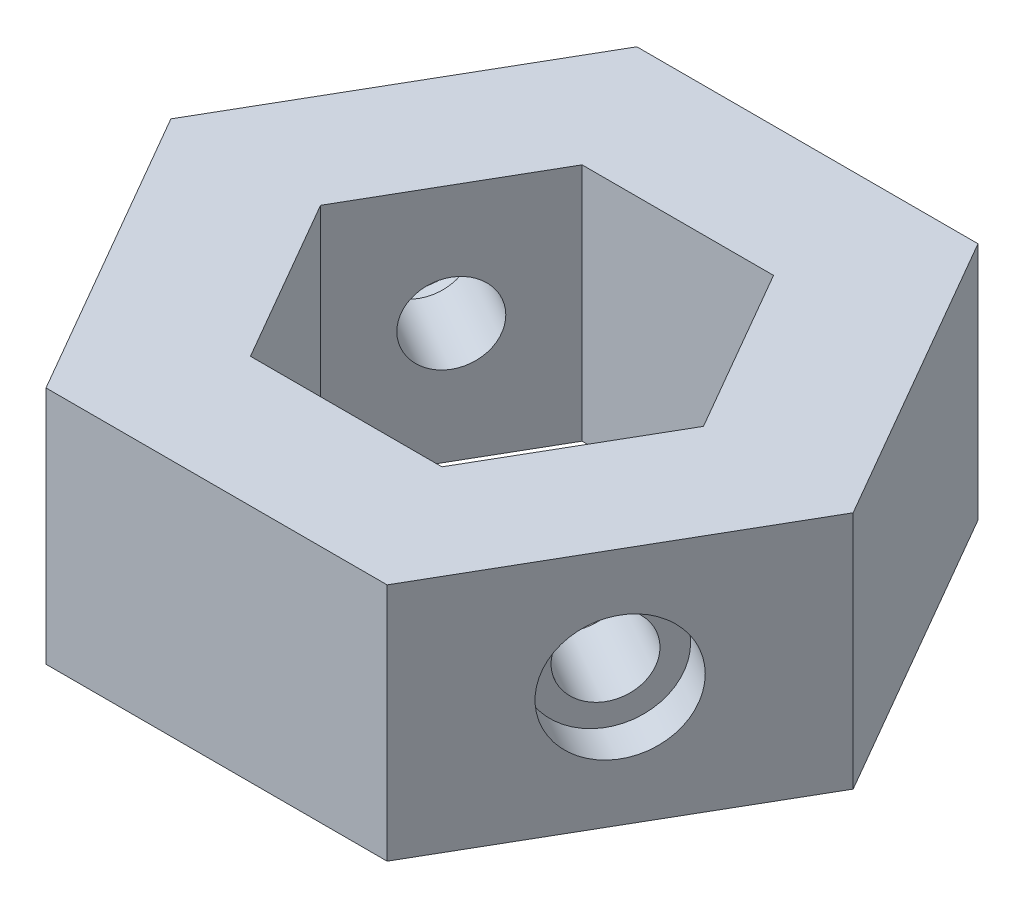
ISO-10303-21;
HEADER;
FILE_DESCRIPTION(('STEP AP214'),'2;1');
FILE_NAME('part.step','',(''),(''),'','','');
FILE_SCHEMA(('AUTOMOTIVE_DESIGN { 1 0 10303 214 1 1 1 1 }'));
ENDSEC;
DATA;
#1=APPLICATION_CONTEXT('core data for automotive mechanical design processes');
#2=APPLICATION_PROTOCOL_DEFINITION('international standard','automotive_design',2000,#1);
#3=PRODUCT_CONTEXT('',#1,'mechanical');
#4=PRODUCT('Part','Part','',(#3));
#5=PRODUCT_RELATED_PRODUCT_CATEGORY('part','',(#4));
#6=PRODUCT_DEFINITION_FORMATION('','',#4);
#7=PRODUCT_DEFINITION_CONTEXT('part definition',#1,'design');
#8=PRODUCT_DEFINITION('design','',#6,#7);
#9=PRODUCT_DEFINITION_SHAPE('','',#8);
#10=(LENGTH_UNIT() NAMED_UNIT(*) SI_UNIT(.MILLI.,.METRE.));
#11=(NAMED_UNIT(*) PLANE_ANGLE_UNIT() SI_UNIT($,.RADIAN.));
#12=(NAMED_UNIT(*) SI_UNIT($,.STERADIAN.) SOLID_ANGLE_UNIT());
#13=UNCERTAINTY_MEASURE_WITH_UNIT(LENGTH_MEASURE(1.E-05),#10,'distance_accuracy_value','');
#14=(GEOMETRIC_REPRESENTATION_CONTEXT(3) GLOBAL_UNCERTAINTY_ASSIGNED_CONTEXT((#13)) GLOBAL_UNIT_ASSIGNED_CONTEXT((#10,
#11,#12)) REPRESENTATION_CONTEXT('',''));
#15=CARTESIAN_POINT('',(0.,0.,0.));
#16=DIRECTION('',(0.,0.,1.));
#17=DIRECTION('',(1.,0.,0.));
#18=AXIS2_PLACEMENT_3D('',#15,#16,#17);
#19=CARTESIAN_POINT('',(0.,9.525,0.));
#20=DIRECTION('',(0.,1.,0.));
#21=DIRECTION('',(0.,0.,1.));
#22=AXIS2_PLACEMENT_3D('',#19,#20,#21);
#23=PLANE('',#22);
#24=DIRECTION('',(0.5,0.,-0.866025403784439));
#25=VECTOR('',#24,1.);
#26=CARTESIAN_POINT('',(6.78876654510022,9.525,11.7584885768374));
#27=LINE('',#26,#25);
#28=CARTESIAN_POINT('',(6.78876654510022,9.525,11.7584885768374));
#29=VERTEX_POINT('',#28);
#30=CARTESIAN_POINT('',(13.5775330902004,9.525,0.));
#31=VERTEX_POINT('',#30);
#32=EDGE_CURVE('E176',#29,#31,#27,.T.);
#33=ORIENTED_EDGE('',*,*,#32,.T.);
#34=DIRECTION('',(-0.5,0.,-0.866025403784439));
#35=VECTOR('',#34,1.);
#36=CARTESIAN_POINT('',(13.5775330902004,9.525,0.));
#37=LINE('',#36,#35);
#38=CARTESIAN_POINT('',(6.78876654510022,9.525,-11.7584885768374));
#39=VERTEX_POINT('',#38);
#40=EDGE_CURVE('E179',#31,#39,#37,.T.);
#41=ORIENTED_EDGE('',*,*,#40,.T.);
#42=DIRECTION('',(-1.,0.,0.));
#43=VECTOR('',#42,1.);
#44=CARTESIAN_POINT('',(6.78876654510022,9.525,-11.7584885768374));
#45=LINE('',#44,#43);
#46=CARTESIAN_POINT('',(-6.78876654510022,9.525,-11.7584885768374));
#47=VERTEX_POINT('',#46);
#48=EDGE_CURVE('E182',#39,#47,#45,.T.);
#49=ORIENTED_EDGE('',*,*,#48,.T.);
#50=DIRECTION('',(-0.5,0.,0.866025403784439));
#51=VECTOR('',#50,1.);
#52=CARTESIAN_POINT('',(-6.78876654510022,9.525,-11.7584885768374));
#53=LINE('',#52,#51);
#54=CARTESIAN_POINT('',(-13.5775330902004,9.525,0.));
#55=VERTEX_POINT('',#54);
#56=EDGE_CURVE('E184',#47,#55,#53,.T.);
#57=ORIENTED_EDGE('',*,*,#56,.T.);
#58=DIRECTION('',(0.5,0.,0.866025403784438));
#59=VECTOR('',#58,1.);
#60=CARTESIAN_POINT('',(-13.5775330902004,9.525,0.));
#61=LINE('',#60,#59);
#62=CARTESIAN_POINT('',(-6.78876654510022,9.525,11.7584885768374));
#63=VERTEX_POINT('',#62);
#64=EDGE_CURVE('E186',#55,#63,#61,.T.);
#65=ORIENTED_EDGE('',*,*,#64,.T.);
#66=DIRECTION('',(1.,0.,0.));
#67=VECTOR('',#66,1.);
#68=CARTESIAN_POINT('',(-6.78876654510022,9.525,11.7584885768374));
#69=LINE('',#68,#67);
#70=EDGE_CURVE('E188',#63,#29,#69,.T.);
#71=ORIENTED_EDGE('',*,*,#70,.T.);
#72=EDGE_LOOP('',(#33,#41,#49,#57,#65,#71));
#73=FACE_BOUND('',#72,.T.);
#74=DIRECTION('',(-0.500000000000001,0.,-0.866025403784438));
#75=VECTOR('',#74,1.);
#76=CARTESIAN_POINT('',(7.61999999999998,9.525,0.));
#77=LINE('',#76,#75);
#78=CARTESIAN_POINT('',(7.61999999999998,9.525,0.));
#79=VERTEX_POINT('',#78);
#80=CARTESIAN_POINT('',(3.80999999999998,9.525,-6.59911357683742));
#81=VERTEX_POINT('',#80);
#82=EDGE_CURVE('E131',#79,#81,#77,.T.);
#83=ORIENTED_EDGE('',*,*,#82,.F.);
#84=DIRECTION('',(0.499999999999995,0.,-0.866025403784442));
#85=VECTOR('',#84,1.);
#86=CARTESIAN_POINT('',(3.81000000000007,9.525,6.59911357683736));
#87=LINE('',#86,#85);
#88=CARTESIAN_POINT('',(3.81000000000007,9.525,6.59911357683736));
#89=VERTEX_POINT('',#88);
#90=EDGE_CURVE('E123',#89,#79,#87,.T.);
#91=ORIENTED_EDGE('',*,*,#90,.F.);
#92=DIRECTION('',(1.,0.,0.));
#93=VECTOR('',#92,1.);
#94=CARTESIAN_POINT('',(-3.80999999999993,9.525,6.59911357683744));
#95=LINE('',#94,#93);
#96=CARTESIAN_POINT('',(-3.80999999999993,9.525,6.59911357683744));
#97=VERTEX_POINT('',#96);
#98=EDGE_CURVE('E153',#97,#89,#95,.T.);
#99=ORIENTED_EDGE('',*,*,#98,.F.);
#100=DIRECTION('',(0.500000000000007,0.,0.866025403784435));
#101=VECTOR('',#100,1.);
#102=CARTESIAN_POINT('',(-7.61999999999998,9.525,0.));
#103=LINE('',#102,#101);
#104=CARTESIAN_POINT('',(-7.61999999999998,9.525,0.));
#105=VERTEX_POINT('',#104);
#106=EDGE_CURVE('E151',#105,#97,#103,.T.);
#107=ORIENTED_EDGE('',*,*,#106,.F.);
#108=DIRECTION('',(-0.499999999999995,0.,0.866025403784441));
#109=VECTOR('',#108,1.);
#110=CARTESIAN_POINT('',(-3.81000000000002,9.525,-6.59911357683739));
#111=LINE('',#110,#109);
#112=CARTESIAN_POINT('',(-3.81000000000002,9.525,-6.59911357683739));
#113=VERTEX_POINT('',#112);
#114=EDGE_CURVE('E146',#113,#105,#111,.T.);
#115=ORIENTED_EDGE('',*,*,#114,.F.);
#116=DIRECTION('',(-1.,0.,0.));
#117=VECTOR('',#116,1.);
#118=CARTESIAN_POINT('',(3.80999999999998,9.525,-6.59911357683742));
#119=LINE('',#118,#117);
#120=EDGE_CURVE('E144',#81,#113,#119,.T.);
#121=ORIENTED_EDGE('',*,*,#120,.F.);
#122=EDGE_LOOP('',(#83,#91,#99,#107,#115,#121));
#123=FACE_BOUND('',#122,.T.);
#124=ADVANCED_FACE('F32',(#73,#123),#23,.T.);
#125=CARTESIAN_POINT('',(0.,0.,0.));
#126=DIRECTION('',(0.,1.,0.));
#127=DIRECTION('',(0.,0.,1.));
#128=AXIS2_PLACEMENT_3D('',#125,#126,#127);
#129=PLANE('',#128);
#130=DIRECTION('',(0.5,0.,-0.866025403784439));
#131=VECTOR('',#130,1.);
#132=CARTESIAN_POINT('',(6.78876654510022,0.,11.7584885768374));
#133=LINE('',#132,#131);
#134=CARTESIAN_POINT('',(6.78876654510022,0.,11.7584885768374));
#135=VERTEX_POINT('',#134);
#136=CARTESIAN_POINT('',(13.5775330902004,0.,0.));
#137=VERTEX_POINT('',#136);
#138=EDGE_CURVE('E139',#135,#137,#133,.T.);
#139=ORIENTED_EDGE('',*,*,#138,.F.);
#140=DIRECTION('',(1.,0.,0.));
#141=VECTOR('',#140,1.);
#142=CARTESIAN_POINT('',(-6.78876654510022,0.,11.7584885768374));
#143=LINE('',#142,#141);
#144=CARTESIAN_POINT('',(-6.78876654510022,0.,11.7584885768374));
#145=VERTEX_POINT('',#144);
#146=EDGE_CURVE('E180',#145,#135,#143,.T.);
#147=ORIENTED_EDGE('',*,*,#146,.F.);
#148=DIRECTION('',(0.5,0.,0.866025403784438));
#149=VECTOR('',#148,1.);
#150=CARTESIAN_POINT('',(-13.5775330902004,0.,0.));
#151=LINE('',#150,#149);
#152=CARTESIAN_POINT('',(-13.5775330902004,0.,0.));
#153=VERTEX_POINT('',#152);
#154=EDGE_CURVE('E199',#153,#145,#151,.T.);
#155=ORIENTED_EDGE('',*,*,#154,.F.);
#156=DIRECTION('',(-0.5,0.,0.866025403784439));
#157=VECTOR('',#156,1.);
#158=CARTESIAN_POINT('',(-6.78876654510022,0.,-11.7584885768374));
#159=LINE('',#158,#157);
#160=CARTESIAN_POINT('',(-6.78876654510022,0.,-11.7584885768374));
#161=VERTEX_POINT('',#160);
#162=EDGE_CURVE('E197',#161,#153,#159,.T.);
#163=ORIENTED_EDGE('',*,*,#162,.F.);
#164=DIRECTION('',(-1.,0.,0.));
#165=VECTOR('',#164,1.);
#166=CARTESIAN_POINT('',(6.78876654510022,0.,-11.7584885768374));
#167=LINE('',#166,#165);
#168=CARTESIAN_POINT('',(6.78876654510022,0.,-11.7584885768374));
#169=VERTEX_POINT('',#168);
#170=EDGE_CURVE('E195',#169,#161,#167,.T.);
#171=ORIENTED_EDGE('',*,*,#170,.F.);
#172=DIRECTION('',(-0.5,0.,-0.866025403784439));
#173=VECTOR('',#172,1.);
#174=CARTESIAN_POINT('',(13.5775330902004,0.,0.));
#175=LINE('',#174,#173);
#176=EDGE_CURVE('E193',#137,#169,#175,.T.);
#177=ORIENTED_EDGE('',*,*,#176,.F.);
#178=EDGE_LOOP('',(#139,#147,#155,#163,#171,#177));
#179=FACE_BOUND('',#178,.T.);
#180=DIRECTION('',(0.499999999999995,0.,-0.866025403784442));
#181=VECTOR('',#180,1.);
#182=CARTESIAN_POINT('',(3.81000000000007,0.,6.59911357683736));
#183=LINE('',#182,#181);
#184=CARTESIAN_POINT('',(3.81000000000007,0.,6.59911357683736));
#185=VERTEX_POINT('',#184);
#186=CARTESIAN_POINT('',(7.61999999999998,0.,0.));
#187=VERTEX_POINT('',#186);
#188=EDGE_CURVE('E57',#185,#187,#183,.T.);
#189=ORIENTED_EDGE('',*,*,#188,.T.);
#190=DIRECTION('',(-0.500000000000001,0.,-0.866025403784438));
#191=VECTOR('',#190,1.);
#192=CARTESIAN_POINT('',(7.61999999999998,0.,0.));
#193=LINE('',#192,#191);
#194=CARTESIAN_POINT('',(3.80999999999998,0.,-6.59911357683742));
#195=VERTEX_POINT('',#194);
#196=EDGE_CURVE('E138',#187,#195,#193,.T.);
#197=ORIENTED_EDGE('',*,*,#196,.T.);
#198=DIRECTION('',(-1.,0.,0.));
#199=VECTOR('',#198,1.);
#200=CARTESIAN_POINT('',(3.80999999999998,0.,-6.59911357683742));
#201=LINE('',#200,#199);
#202=CARTESIAN_POINT('',(-3.81000000000002,0.,-6.59911357683739));
#203=VERTEX_POINT('',#202);
#204=EDGE_CURVE('E158',#195,#203,#201,.T.);
#205=ORIENTED_EDGE('',*,*,#204,.T.);
#206=DIRECTION('',(-0.499999999999995,0.,0.866025403784441));
#207=VECTOR('',#206,1.);
#208=CARTESIAN_POINT('',(-3.81000000000002,0.,-6.59911357683739));
#209=LINE('',#208,#207);
#210=CARTESIAN_POINT('',(-7.61999999999998,0.,0.));
#211=VERTEX_POINT('',#210);
#212=EDGE_CURVE('E161',#203,#211,#209,.T.);
#213=ORIENTED_EDGE('',*,*,#212,.T.);
#214=DIRECTION('',(0.500000000000007,0.,0.866025403784435));
#215=VECTOR('',#214,1.);
#216=CARTESIAN_POINT('',(-7.61999999999998,0.,0.));
#217=LINE('',#216,#215);
#218=CARTESIAN_POINT('',(-3.80999999999993,0.,6.59911357683744));
#219=VERTEX_POINT('',#218);
#220=EDGE_CURVE('E164',#211,#219,#217,.T.);
#221=ORIENTED_EDGE('',*,*,#220,.T.);
#222=DIRECTION('',(1.,0.,0.));
#223=VECTOR('',#222,1.);
#224=CARTESIAN_POINT('',(-3.80999999999993,0.,6.59911357683744));
#225=LINE('',#224,#223);
#226=EDGE_CURVE('E132',#219,#185,#225,.T.);
#227=ORIENTED_EDGE('',*,*,#226,.T.);
#228=EDGE_LOOP('',(#189,#197,#205,#213,#221,#227));
#229=FACE_BOUND('',#228,.T.);
#230=ADVANCED_FACE('F246',(#179,#229),#129,.F.);
#231=CARTESIAN_POINT('',(6.78876654510022,9.525,11.7584885768374));
#232=DIRECTION('',(-0.866025403784439,0.,-0.5));
#233=DIRECTION('',(-0.5,0.,0.866025403784439));
#234=AXIS2_PLACEMENT_3D('',#231,#232,#233);
#235=PLANE('',#234);
#236=CARTESIAN_POINT('',(10.1831498176503,4.7625,5.8792442884187));
#237=DIRECTION('',(0.866025403784439,0.,0.5));
#238=DIRECTION('',(0.5,0.,-0.866025403784439));
#239=AXIS2_PLACEMENT_3D('',#236,#237,#238);
#240=CIRCLE('',#239,2.48046875);
#241=CARTESIAN_POINT('',(11.4233841926503,4.7625,3.73109533762527));
#242=VERTEX_POINT('',#241);
#243=EDGE_CURVE('E216',#242,#242,#240,.T.);
#244=ORIENTED_EDGE('',*,*,#243,.F.);
#245=EDGE_LOOP('',(#244));
#246=FACE_BOUND('',#245,.T.);
#247=ORIENTED_EDGE('',*,*,#138,.T.);
#248=DIRECTION('',(0.,-1.,0.));
#249=VECTOR('',#248,1.);
#250=CARTESIAN_POINT('',(13.5775330902004,9.525,0.));
#251=LINE('',#250,#249);
#252=EDGE_CURVE('E11',#31,#137,#251,.T.);
#253=ORIENTED_EDGE('',*,*,#252,.F.);
#254=ORIENTED_EDGE('',*,*,#32,.F.);
#255=DIRECTION('',(0.,-1.,0.));
#256=VECTOR('',#255,1.);
#257=CARTESIAN_POINT('',(6.78876654510022,9.525,11.7584885768374));
#258=LINE('',#257,#256);
#259=EDGE_CURVE('E190',#29,#135,#258,.T.);
#260=ORIENTED_EDGE('',*,*,#259,.T.);
#261=EDGE_LOOP('',(#247,#253,#254,#260));
#262=FACE_BOUND('',#261,.T.);
#263=ADVANCED_FACE('F34',(#246,#262),#235,.F.);
#264=CARTESIAN_POINT('',(13.5775330902004,9.525,0.));
#265=DIRECTION('',(-0.866025403784439,0.,0.5));
#266=DIRECTION('',(0.5,0.,0.866025403784438));
#267=AXIS2_PLACEMENT_3D('',#264,#265,#266);
#268=PLANE('',#267);
#269=ORIENTED_EDGE('',*,*,#176,.T.);
#270=DIRECTION('',(0.,-1.,0.));
#271=VECTOR('',#270,1.);
#272=CARTESIAN_POINT('',(6.78876654510022,9.525,-11.7584885768374));
#273=LINE('',#272,#271);
#274=EDGE_CURVE('E41',#39,#169,#273,.T.);
#275=ORIENTED_EDGE('',*,*,#274,.F.);
#276=ORIENTED_EDGE('',*,*,#40,.F.);
#277=ORIENTED_EDGE('',*,*,#252,.T.);
#278=EDGE_LOOP('',(#269,#275,#276,#277));
#279=FACE_BOUND('',#278,.T.);
#280=ADVANCED_FACE('F245',(#279),#268,.F.);
#281=CARTESIAN_POINT('',(6.78876654510022,9.525,-11.7584885768374));
#282=DIRECTION('',(0.,0.,1.));
#283=DIRECTION('',(1.,0.,0.));
#284=AXIS2_PLACEMENT_3D('',#281,#282,#283);
#285=PLANE('',#284);
#286=ORIENTED_EDGE('',*,*,#170,.T.);
#287=DIRECTION('',(0.,-1.,0.));
#288=VECTOR('',#287,1.);
#289=CARTESIAN_POINT('',(-6.78876654510022,9.525,-11.7584885768374));
#290=LINE('',#289,#288);
#291=EDGE_CURVE('E210',#47,#161,#290,.T.);
#292=ORIENTED_EDGE('',*,*,#291,.F.);
#293=ORIENTED_EDGE('',*,*,#48,.F.);
#294=ORIENTED_EDGE('',*,*,#274,.T.);
#295=EDGE_LOOP('',(#286,#292,#293,#294));
#296=FACE_BOUND('',#295,.T.);
#297=ADVANCED_FACE('F274',(#296),#285,.F.);
#298=CARTESIAN_POINT('',(-6.78876654510022,9.525,-11.7584885768374));
#299=DIRECTION('',(0.866025403784439,0.,0.5));
#300=DIRECTION('',(0.5,0.,-0.866025403784439));
#301=AXIS2_PLACEMENT_3D('',#298,#299,#300);
#302=PLANE('',#301);
#303=CARTESIAN_POINT('',(-10.1831498176503,4.7625,-5.8792442884187));
#304=DIRECTION('',(-0.866025403784439,0.,-0.5));
#305=DIRECTION('',(-0.5,0.,0.866025403784439));
#306=AXIS2_PLACEMENT_3D('',#303,#304,#305);
#307=CIRCLE('',#306,2.45760875);
#308=CARTESIAN_POINT('',(-11.4119541926503,4.7625,-3.75089267835578));
#309=VERTEX_POINT('',#308);
#310=EDGE_CURVE('E227',#309,#309,#307,.T.);
#311=ORIENTED_EDGE('',*,*,#310,.F.);
#312=EDGE_LOOP('',(#311));
#313=FACE_BOUND('',#312,.T.);
#314=ORIENTED_EDGE('',*,*,#162,.T.);
#315=DIRECTION('',(0.,-1.,0.));
#316=VECTOR('',#315,1.);
#317=CARTESIAN_POINT('',(-13.5775330902004,9.525,0.));
#318=LINE('',#317,#316);
#319=EDGE_CURVE('E207',#55,#153,#318,.T.);
#320=ORIENTED_EDGE('',*,*,#319,.F.);
#321=ORIENTED_EDGE('',*,*,#56,.F.);
#322=ORIENTED_EDGE('',*,*,#291,.T.);
#323=EDGE_LOOP('',(#314,#320,#321,#322));
#324=FACE_BOUND('',#323,.T.);
#325=ADVANCED_FACE('F270',(#313,#324),#302,.F.);
#326=CARTESIAN_POINT('',(-13.5775330902004,9.525,0.));
#327=DIRECTION('',(0.866025403784439,0.,-0.5));
#328=DIRECTION('',(-0.5,0.,-0.866025403784438));
#329=AXIS2_PLACEMENT_3D('',#326,#327,#328);
#330=PLANE('',#329);
#331=ORIENTED_EDGE('',*,*,#154,.T.);
#332=DIRECTION('',(0.,-1.,0.));
#333=VECTOR('',#332,1.);
#334=CARTESIAN_POINT('',(-6.78876654510022,9.525,11.7584885768374));
#335=LINE('',#334,#333);
#336=EDGE_CURVE('E204',#63,#145,#335,.T.);
#337=ORIENTED_EDGE('',*,*,#336,.F.);
#338=ORIENTED_EDGE('',*,*,#64,.F.);
#339=ORIENTED_EDGE('',*,*,#319,.T.);
#340=EDGE_LOOP('',(#331,#337,#338,#339));
#341=FACE_BOUND('',#340,.T.);
#342=ADVANCED_FACE('F267',(#341),#330,.F.);
#343=CARTESIAN_POINT('',(-6.78876654510022,9.525,11.7584885768374));
#344=DIRECTION('',(0.,0.,-1.));
#345=DIRECTION('',(-1.,0.,0.));
#346=AXIS2_PLACEMENT_3D('',#343,#344,#345);
#347=PLANE('',#346);
#348=ORIENTED_EDGE('',*,*,#146,.T.);
#349=ORIENTED_EDGE('',*,*,#259,.F.);
#350=ORIENTED_EDGE('',*,*,#70,.F.);
#351=ORIENTED_EDGE('',*,*,#336,.T.);
#352=EDGE_LOOP('',(#348,#349,#350,#351));
#353=FACE_BOUND('',#352,.T.);
#354=ADVANCED_FACE('F265',(#353),#347,.F.);
#355=CARTESIAN_POINT('',(3.81000000000007,9.525,6.59911357683736));
#356=DIRECTION('',(-0.866025403784442,0.,-0.499999999999995));
#357=DIRECTION('',(-0.499999999999995,0.,0.866025403784442));
#358=AXIS2_PLACEMENT_3D('',#355,#356,#357);
#359=PLANE('',#358);
#360=CARTESIAN_POINT('',(5.71500000000001,4.7625,3.29955678841871));
#361=DIRECTION('',(-0.866025403784442,0.,-0.499999999999995));
#362=DIRECTION('',(-0.499999999999995,0.,0.866025403784442));
#363=AXIS2_PLACEMENT_3D('',#360,#361,#362);
#364=CIRCLE('',#363,1.5875);
#365=CARTESIAN_POINT('',(6.50875,4.7625,1.92474145991091));
#366=VERTEX_POINT('',#365);
#367=EDGE_CURVE('E214',#366,#366,#364,.T.);
#368=ORIENTED_EDGE('',*,*,#367,.F.);
#369=EDGE_LOOP('',(#368));
#370=FACE_BOUND('',#369,.T.);
#371=ORIENTED_EDGE('',*,*,#188,.F.);
#372=DIRECTION('',(0.,-1.,0.));
#373=VECTOR('',#372,1.);
#374=CARTESIAN_POINT('',(3.81000000000007,9.525,6.59911357683736));
#375=LINE('',#374,#373);
#376=EDGE_CURVE('E127',#89,#185,#375,.T.);
#377=ORIENTED_EDGE('',*,*,#376,.F.);
#378=ORIENTED_EDGE('',*,*,#90,.T.);
#379=DIRECTION('',(0.,-1.,0.));
#380=VECTOR('',#379,1.);
#381=CARTESIAN_POINT('',(7.61999999999998,9.525,0.));
#382=LINE('',#381,#380);
#383=EDGE_CURVE('E126',#79,#187,#382,.T.);
#384=ORIENTED_EDGE('',*,*,#383,.T.);
#385=EDGE_LOOP('',(#371,#377,#378,#384));
#386=FACE_BOUND('',#385,.T.);
#387=ADVANCED_FACE('F125',(#370,#386),#359,.T.);
#388=CARTESIAN_POINT('',(7.61999999999998,9.525,0.));
#389=DIRECTION('',(-0.866025403784438,0.,0.500000000000001));
#390=DIRECTION('',(0.500000000000001,0.,0.866025403784438));
#391=AXIS2_PLACEMENT_3D('',#388,#389,#390);
#392=PLANE('',#391);
#393=ORIENTED_EDGE('',*,*,#196,.F.);
#394=ORIENTED_EDGE('',*,*,#383,.F.);
#395=ORIENTED_EDGE('',*,*,#82,.T.);
#396=DIRECTION('',(0.,-1.,0.));
#397=VECTOR('',#396,1.);
#398=CARTESIAN_POINT('',(3.80999999999998,9.525,-6.59911357683742));
#399=LINE('',#398,#397);
#400=EDGE_CURVE('E140',#81,#195,#399,.T.);
#401=ORIENTED_EDGE('',*,*,#400,.T.);
#402=EDGE_LOOP('',(#393,#394,#395,#401));
#403=FACE_BOUND('',#402,.T.);
#404=ADVANCED_FACE('F135',(#403),#392,.T.);
#405=CARTESIAN_POINT('',(3.80999999999998,9.525,-6.59911357683742));
#406=DIRECTION('',(0.,0.,1.));
#407=DIRECTION('',(1.,0.,0.));
#408=AXIS2_PLACEMENT_3D('',#405,#406,#407);
#409=PLANE('',#408);
#410=ORIENTED_EDGE('',*,*,#204,.F.);
#411=ORIENTED_EDGE('',*,*,#400,.F.);
#412=ORIENTED_EDGE('',*,*,#120,.T.);
#413=DIRECTION('',(0.,-1.,0.));
#414=VECTOR('',#413,1.);
#415=CARTESIAN_POINT('',(-3.81000000000002,9.525,-6.59911357683739));
#416=LINE('',#415,#414);
#417=EDGE_CURVE('E173',#113,#203,#416,.T.);
#418=ORIENTED_EDGE('',*,*,#417,.T.);
#419=EDGE_LOOP('',(#410,#411,#412,#418));
#420=FACE_BOUND('',#419,.T.);
#421=ADVANCED_FACE('F317',(#420),#409,.T.);
#422=CARTESIAN_POINT('',(-3.81000000000002,9.525,-6.59911357683739));
#423=DIRECTION('',(0.866025403784442,0.,0.499999999999995));
#424=DIRECTION('',(0.499999999999995,0.,-0.866025403784442));
#425=AXIS2_PLACEMENT_3D('',#422,#423,#424);
#426=PLANE('',#425);
#427=CARTESIAN_POINT('',(-5.71499999999999,4.7625,-3.2995567884187));
#428=DIRECTION('',(0.866025403784442,0.,0.499999999999995));
#429=DIRECTION('',(0.499999999999995,0.,-0.866025403784442));
#430=AXIS2_PLACEMENT_3D('',#427,#428,#429);
#431=CIRCLE('',#430,1.5875);
#432=CARTESIAN_POINT('',(-4.92124999999999,4.7625,-4.6743721169265));
#433=VERTEX_POINT('',#432);
#434=EDGE_CURVE('E36',#433,#433,#431,.T.);
#435=ORIENTED_EDGE('',*,*,#434,.F.);
#436=EDGE_LOOP('',(#435));
#437=FACE_BOUND('',#436,.T.);
#438=ORIENTED_EDGE('',*,*,#212,.F.);
#439=ORIENTED_EDGE('',*,*,#417,.F.);
#440=ORIENTED_EDGE('',*,*,#114,.T.);
#441=DIRECTION('',(0.,-1.,0.));
#442=VECTOR('',#441,1.);
#443=CARTESIAN_POINT('',(-7.61999999999998,9.525,0.));
#444=LINE('',#443,#442);
#445=EDGE_CURVE('E171',#105,#211,#444,.T.);
#446=ORIENTED_EDGE('',*,*,#445,.T.);
#447=EDGE_LOOP('',(#438,#439,#440,#446));
#448=FACE_BOUND('',#447,.T.);
#449=ADVANCED_FACE('F323',(#437,#448),#426,.T.);
#450=CARTESIAN_POINT('',(-7.61999999999998,9.525,0.));
#451=DIRECTION('',(0.866025403784435,0.,-0.500000000000007));
#452=DIRECTION('',(-0.500000000000007,0.,-0.866025403784435));
#453=AXIS2_PLACEMENT_3D('',#450,#451,#452);
#454=PLANE('',#453);
#455=ORIENTED_EDGE('',*,*,#220,.F.);
#456=ORIENTED_EDGE('',*,*,#445,.F.);
#457=ORIENTED_EDGE('',*,*,#106,.T.);
#458=DIRECTION('',(0.,-1.,0.));
#459=VECTOR('',#458,1.);
#460=CARTESIAN_POINT('',(-3.80999999999993,9.525,6.59911357683744));
#461=LINE('',#460,#459);
#462=EDGE_CURVE('E49',#97,#219,#461,.T.);
#463=ORIENTED_EDGE('',*,*,#462,.T.);
#464=EDGE_LOOP('',(#455,#456,#457,#463));
#465=FACE_BOUND('',#464,.T.);
#466=ADVANCED_FACE('F332',(#465),#454,.T.);
#467=CARTESIAN_POINT('',(-3.80999999999993,9.525,6.59911357683744));
#468=DIRECTION('',(0.,0.,-1.));
#469=DIRECTION('',(-1.,0.,0.));
#470=AXIS2_PLACEMENT_3D('',#467,#468,#469);
#471=PLANE('',#470);
#472=ORIENTED_EDGE('',*,*,#226,.F.);
#473=ORIENTED_EDGE('',*,*,#462,.F.);
#474=ORIENTED_EDGE('',*,*,#98,.T.);
#475=ORIENTED_EDGE('',*,*,#376,.T.);
#476=EDGE_LOOP('',(#472,#473,#474,#475));
#477=FACE_BOUND('',#476,.T.);
#478=ADVANCED_FACE('F239',(#477),#471,.T.);
#479=CARTESIAN_POINT('',(8.80833448914254,4.7625,5.0854942884187));
#480=DIRECTION('',(0.866025403784439,0.,0.5));
#481=DIRECTION('',(0.5,0.,-0.866025403784439));
#482=AXIS2_PLACEMENT_3D('',#479,#480,#481);
#483=CYLINDRICAL_SURFACE('',#482,2.48046875);
#484=CARTESIAN_POINT('',(8.80833448914254,4.7625,5.0854942884187));
#485=DIRECTION('',(0.866025403784439,0.,0.5));
#486=DIRECTION('',(0.5,0.,-0.866025403784439));
#487=AXIS2_PLACEMENT_3D('',#484,#485,#486);
#488=CIRCLE('',#487,2.48046875);
#489=CARTESIAN_POINT('',(10.0485688641425,4.7625,2.93734533762527));
#490=VERTEX_POINT('',#489);
#491=EDGE_CURVE('E156',#490,#490,#488,.T.);
#492=ORIENTED_EDGE('',*,*,#491,.F.);
#493=EDGE_LOOP('',(#492));
#494=FACE_BOUND('',#493,.T.);
#495=ORIENTED_EDGE('',*,*,#243,.T.);
#496=EDGE_LOOP('',(#495));
#497=FACE_BOUND('',#496,.T.);
#498=ADVANCED_FACE('F236',(#494,#497),#483,.F.);
#499=CARTESIAN_POINT('',(8.80833448914254,4.7625,5.0854942884187));
#500=DIRECTION('',(0.866025403784439,0.,0.5));
#501=DIRECTION('',(0.5,0.,-0.866025403784439));
#502=AXIS2_PLACEMENT_3D('',#499,#500,#501);
#503=PLANE('',#502);
#504=CARTESIAN_POINT('',(8.80833448914254,4.7625,5.08549428841871));
#505=DIRECTION('',(0.866025403784439,0.,0.5));
#506=DIRECTION('',(0.5,0.,-0.866025403784439));
#507=AXIS2_PLACEMENT_3D('',#504,#505,#506);
#508=CIRCLE('',#507,1.5875);
#509=CARTESIAN_POINT('',(9.60208448914254,4.7625,3.71067895991091));
#510=VERTEX_POINT('',#509);
#511=EDGE_CURVE('E217',#510,#510,#508,.T.);
#512=ORIENTED_EDGE('',*,*,#511,.F.);
#513=EDGE_LOOP('',(#512));
#514=FACE_BOUND('',#513,.T.);
#515=ORIENTED_EDGE('',*,*,#491,.T.);
#516=EDGE_LOOP('',(#515));
#517=FACE_BOUND('',#516,.T.);
#518=ADVANCED_FACE('F234',(#514,#517),#503,.T.);
#519=CARTESIAN_POINT('',(3.30907317511136,4.7625,1.91049428841871));
#520=DIRECTION('',(0.866025403784439,0.,0.5));
#521=DIRECTION('',(0.5,0.,-0.866025403784439));
#522=AXIS2_PLACEMENT_3D('',#519,#520,#521);
#523=CYLINDRICAL_SURFACE('',#522,1.5875);
#524=CARTESIAN_POINT('',(6.50875,4.7625,1.92474145991091));
#525=CARTESIAN_POINT('',(6.5409722342619,4.7625,1.94334497553591));
#526=CARTESIAN_POINT('',(6.5731944685238,4.7625,1.96194849116091));
#527=CARTESIAN_POINT('',(6.63763893704761,4.7625,1.99915552241091));
#528=CARTESIAN_POINT('',(6.66986117130951,4.7625,2.01775903803591));
#529=CARTESIAN_POINT('',(6.73430563983331,4.7625,2.05496606928591));
#530=CARTESIAN_POINT('',(6.76652787409521,4.7625,2.07356958491091));
#531=CARTESIAN_POINT('',(6.83097234261902,4.7625,2.11077661616091));
#532=CARTESIAN_POINT('',(6.86319457688092,4.7625,2.12938013178591));
#533=CARTESIAN_POINT('',(6.92763904540472,4.7625,2.16658716303591));
#534=CARTESIAN_POINT('',(6.95986127966662,4.7625,2.18519067866091));
#535=CARTESIAN_POINT('',(7.02430574819043,4.7625,2.22239770991091));
#536=CARTESIAN_POINT('',(7.05652798245233,4.7625,2.24100122553591));
#537=CARTESIAN_POINT('',(7.12097245097613,4.7625,2.27820825678591));
#538=CARTESIAN_POINT('',(7.15319468523803,4.7625,2.29681177241091));
#539=CARTESIAN_POINT('',(7.21763915376183,4.7625,2.33401880366091));
#540=CARTESIAN_POINT('',(7.24986138802374,4.7625,2.35262231928591));
#541=CARTESIAN_POINT('',(7.31430585654754,4.7625,2.38982935053591));
#542=CARTESIAN_POINT('',(7.34652809080944,4.7625,2.40843286616091));
#543=CARTESIAN_POINT('',(7.41097255933324,4.7625,2.44563989741091));
#544=CARTESIAN_POINT('',(7.44319479359514,4.7625,2.46424341303591));
#545=CARTESIAN_POINT('',(7.50763926211895,4.7625,2.50145044428591));
#546=CARTESIAN_POINT('',(7.53986149638085,4.7625,2.52005395991091));
#547=CARTESIAN_POINT('',(7.60430596490465,4.7625,2.55726099116091));
#548=CARTESIAN_POINT('',(7.63652819916655,4.7625,2.57586450678591));
#549=CARTESIAN_POINT('',(7.70097266769036,4.7625,2.61307153803591));
#550=CARTESIAN_POINT('',(7.73319490195226,4.7625,2.63167505366091));
#551=CARTESIAN_POINT('',(7.79763937047606,4.7625,2.66888208491091));
#552=CARTESIAN_POINT('',(7.82986160473796,4.7625,2.68748560053591));
#553=CARTESIAN_POINT('',(7.89430607326176,4.7625,2.72469263178591));
#554=CARTESIAN_POINT('',(7.92652830752367,4.7625,2.74329614741091));
#555=CARTESIAN_POINT('',(7.99097277604747,4.7625,2.78050317866091));
#556=CARTESIAN_POINT('',(8.02319501030937,4.7625,2.79910669428591));
#557=CARTESIAN_POINT('',(8.08763947883317,4.7625,2.83631372553591));
#558=CARTESIAN_POINT('',(8.11986171309507,4.7625,2.85491724116091));
#559=CARTESIAN_POINT('',(8.18430618161888,4.7625,2.89212427241091));
#560=CARTESIAN_POINT('',(8.21652841588078,4.7625,2.91072778803591));
#561=CARTESIAN_POINT('',(8.28097288440458,4.7625,2.94793481928591));
#562=CARTESIAN_POINT('',(8.31319511866648,4.7625,2.96653833491091));
#563=CARTESIAN_POINT('',(8.37763958719029,4.7625,3.00374536616091));
#564=CARTESIAN_POINT('',(8.40986182145219,4.7625,3.02234888178591));
#565=CARTESIAN_POINT('',(8.47430628997599,4.7625,3.05955591303591));
#566=CARTESIAN_POINT('',(8.50652852423789,4.7625,3.07815942866091));
#567=CARTESIAN_POINT('',(8.5709729927617,4.7625,3.11536645991091));
#568=CARTESIAN_POINT('',(8.6031952270236,4.7625,3.13396997553591));
#569=CARTESIAN_POINT('',(8.6676396955474,4.7625,3.17117700678591));
#570=CARTESIAN_POINT('',(8.6998619298093,4.7625,3.18978052241091));
#571=CARTESIAN_POINT('',(8.7643063983331,4.7625,3.22698755366091));
#572=CARTESIAN_POINT('',(8.79652863259501,4.7625,3.24559106928591));
#573=CARTESIAN_POINT('',(8.86097310111881,4.7625,3.28279810053591));
#574=CARTESIAN_POINT('',(8.89319533538071,4.7625,3.30140161616091));
#575=CARTESIAN_POINT('',(8.95763980390451,4.7625,3.33860864741091));
#576=CARTESIAN_POINT('',(8.98986203816641,4.7625,3.35721216303591));
#577=CARTESIAN_POINT('',(9.05430650669022,4.7625,3.39441919428591));
#578=CARTESIAN_POINT('',(9.08652874095212,4.7625,3.41302270991091));
#579=CARTESIAN_POINT('',(9.15097320947592,4.7625,3.45022974116091));
#580=CARTESIAN_POINT('',(9.18319544373782,4.7625,3.46883325678591));
#581=CARTESIAN_POINT('',(9.24763991226163,4.7625,3.50604028803591));
#582=CARTESIAN_POINT('',(9.27986214652353,4.7625,3.52464380366091));
#583=CARTESIAN_POINT('',(9.34430661504733,4.7625,3.56185083491091));
#584=CARTESIAN_POINT('',(9.37652884930923,4.7625,3.58045435053591));
#585=CARTESIAN_POINT('',(9.44097331783304,4.7625,3.61766138178591));
#586=CARTESIAN_POINT('',(9.47319555209494,4.7625,3.63626489741091));
#587=CARTESIAN_POINT('',(9.53764002061874,4.7625,3.67347192866091));
#588=CARTESIAN_POINT('',(9.56986225488064,4.7625,3.69207544428591));
#589=CARTESIAN_POINT('',(9.60208448914254,4.7625,3.71067895991091));
#590=B_SPLINE_CURVE_WITH_KNOTS('',3,(#524,#525,#526,#527,#528,#529,#530,#531,#532,#533,#534,
#535,#536,#537,#538,#539,#540,#541,#542,#543,#544,#545,#546,#547,#548,#549,#550,#551,#552,#553,
#554,#555,#556,#557,#558,#559,#560,#561,#562,#563,#564,#565,#566,#567,#568,#569,#570,#571,#572,
#573,#574,#575,#576,#577,#578,#579,#580,#581,#582,#583,#584,#585,#586,#587,#588,#589),
.UNSPECIFIED.,.F.,.F.,(4,2,2,2,2,2,2,2,2,2,2,2,2,2,2,2,2,2,2,2,2,2,2,2,2,2,2,2,2,2,2,2,4),(0.,
0.111621093750001,0.2232421875,0.33486328125,0.446484375000001,0.558105468750001,0.6697265625,
0.781347656250001,0.89296875,1.00458984375,1.1162109375,1.22783203125,1.339453125,1.45107421875,
1.5626953125,1.67431640625,1.7859375,1.89755859375,2.0091796875,2.12080078125,2.232421875,
2.34404296875,2.4556640625,2.56728515625,2.67890625,2.79052734375,2.9021484375,3.01376953125,
3.125390625,3.23701171875,3.3486328125,3.46025390625,3.571875),.UNSPECIFIED.);
#591=EDGE_CURVE('BSEAM357',#366,#510,#590,.T.);
#592=ORIENTED_EDGE('',*,*,#367,.T.);
#593=ORIENTED_EDGE('',*,*,#511,.T.);
#594=ORIENTED_EDGE('',*,*,#591,.T.);
#595=ORIENTED_EDGE('',*,*,#591,.F.);
#596=EDGE_LOOP('',(#592,#594,#593,#595));
#597=FACE_BOUND('',#596,.T.);
#598=ADVANCED_FACE('F357',(#597),#523,.F.);
#599=CARTESIAN_POINT('',(-8.80833448914254,4.7625,-5.0854942884187));
#600=DIRECTION('',(-0.866025403784439,0.,-0.5));
#601=DIRECTION('',(-0.5,0.,0.866025403784439));
#602=AXIS2_PLACEMENT_3D('',#599,#600,#601);
#603=CYLINDRICAL_SURFACE('',#602,2.45760875);
#604=CARTESIAN_POINT('',(-8.80833448914254,4.7625,-5.0854942884187));
#605=DIRECTION('',(-0.866025403784439,0.,-0.5));
#606=DIRECTION('',(-0.5,0.,0.866025403784439));
#607=AXIS2_PLACEMENT_3D('',#604,#605,#606);
#608=CIRCLE('',#607,2.45760875);
#609=CARTESIAN_POINT('',(-10.0371388641425,4.7625,-2.95714267835578));
#610=VERTEX_POINT('',#609);
#611=EDGE_CURVE('E222',#610,#610,#608,.T.);
#612=ORIENTED_EDGE('',*,*,#611,.F.);
#613=EDGE_LOOP('',(#612));
#614=FACE_BOUND('',#613,.T.);
#615=ORIENTED_EDGE('',*,*,#310,.T.);
#616=EDGE_LOOP('',(#615));
#617=FACE_BOUND('',#616,.T.);
#618=ADVANCED_FACE('F365',(#614,#617),#603,.F.);
#619=CARTESIAN_POINT('',(-8.80833448914254,4.7625,-5.0854942884187));
#620=DIRECTION('',(-0.866025403784439,0.,-0.5));
#621=DIRECTION('',(-0.5,0.,0.866025403784439));
#622=AXIS2_PLACEMENT_3D('',#619,#620,#621);
#623=PLANE('',#622);
#624=CARTESIAN_POINT('',(-8.80833448914254,4.7625,-5.08549428841871));
#625=DIRECTION('',(-0.866025403784439,0.,-0.5));
#626=DIRECTION('',(-0.5,0.,0.866025403784439));
#627=AXIS2_PLACEMENT_3D('',#624,#625,#626);
#628=CIRCLE('',#627,1.5875);
#629=CARTESIAN_POINT('',(-9.60208448914254,4.7625,-3.71067895991091));
#630=VERTEX_POINT('',#629);
#631=EDGE_CURVE('E451',#630,#630,#628,.T.);
#632=ORIENTED_EDGE('',*,*,#631,.F.);
#633=EDGE_LOOP('',(#632));
#634=FACE_BOUND('',#633,.T.);
#635=ORIENTED_EDGE('',*,*,#611,.T.);
#636=EDGE_LOOP('',(#635));
#637=FACE_BOUND('',#636,.T.);
#638=ADVANCED_FACE('F371',(#634,#637),#623,.T.);
#639=CARTESIAN_POINT('',(-3.30907317511136,4.7625,-1.91049428841871));
#640=DIRECTION('',(-0.866025403784439,0.,-0.5));
#641=DIRECTION('',(-0.5,0.,0.866025403784439));
#642=AXIS2_PLACEMENT_3D('',#639,#640,#641);
#643=CYLINDRICAL_SURFACE('',#642,1.5875);
#644=ORIENTED_EDGE('',*,*,#434,.T.);
#645=EDGE_LOOP('',(#644));
#646=FACE_BOUND('',#645,.T.);
#647=ORIENTED_EDGE('',*,*,#631,.T.);
#648=EDGE_LOOP('',(#647));
#649=FACE_BOUND('',#648,.T.);
#650=ADVANCED_FACE('F378',(#646,#649),#643,.F.);
#651=CLOSED_SHELL('',(#124,#230,#263,#280,#297,#325,#342,#354,#387,#404,#421,#449,#466,#478,
#498,#518,#598,#618,#638,#650));
#652=MANIFOLD_SOLID_BREP('B2',#651);
#653=ADVANCED_BREP_SHAPE_REPRESENTATION('',(#18,#652),#14);
#654=SHAPE_DEFINITION_REPRESENTATION(#9,#653);
ENDSEC;
END-ISO-10303-21;
